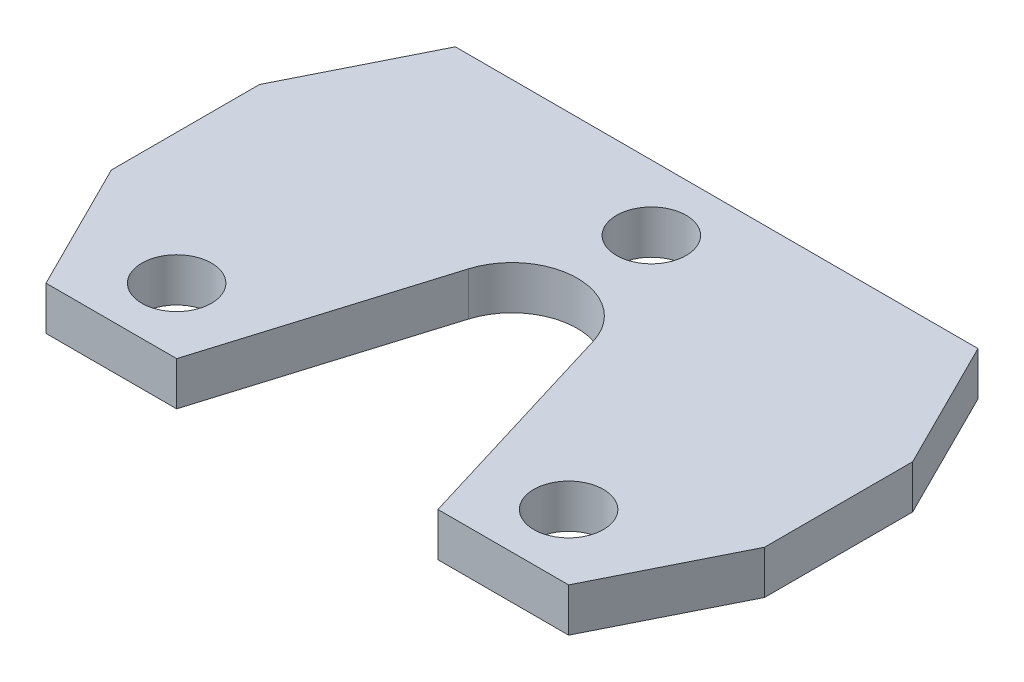
ISO-10303-21;
HEADER;
FILE_DESCRIPTION(('STEP AP214'),'2;1');
FILE_NAME('part.step','',(''),(''),'','','');
FILE_SCHEMA(('AUTOMOTIVE_DESIGN { 1 0 10303 214 1 1 1 1 }'));
ENDSEC;
DATA;
#1=APPLICATION_CONTEXT('core data for automotive mechanical design processes');
#2=APPLICATION_PROTOCOL_DEFINITION('international standard','automotive_design',2000,#1);
#3=PRODUCT_CONTEXT('',#1,'mechanical');
#4=PRODUCT('Part','Part','',(#3));
#5=PRODUCT_RELATED_PRODUCT_CATEGORY('part','',(#4));
#6=PRODUCT_DEFINITION_FORMATION('','',#4);
#7=PRODUCT_DEFINITION_CONTEXT('part definition',#1,'design');
#8=PRODUCT_DEFINITION('design','',#6,#7);
#9=PRODUCT_DEFINITION_SHAPE('','',#8);
#10=(LENGTH_UNIT() NAMED_UNIT(*) SI_UNIT(.MILLI.,.METRE.));
#11=(NAMED_UNIT(*) PLANE_ANGLE_UNIT() SI_UNIT($,.RADIAN.));
#12=(NAMED_UNIT(*) SI_UNIT($,.STERADIAN.) SOLID_ANGLE_UNIT());
#13=UNCERTAINTY_MEASURE_WITH_UNIT(LENGTH_MEASURE(1.E-05),#10,'distance_accuracy_value','');
#14=(GEOMETRIC_REPRESENTATION_CONTEXT(3) GLOBAL_UNCERTAINTY_ASSIGNED_CONTEXT((#13)) GLOBAL_UNIT_ASSIGNED_CONTEXT((#10,
#11,#12)) REPRESENTATION_CONTEXT('',''));
#15=CARTESIAN_POINT('',(0.,0.,0.));
#16=DIRECTION('',(0.,0.,1.));
#17=DIRECTION('',(1.,0.,0.));
#18=AXIS2_PLACEMENT_3D('',#15,#16,#17);
#19=CARTESIAN_POINT('',(-0.000168311706078194,10.,19.6990291262136));
#20=DIRECTION('',(0.,1.,0.));
#21=DIRECTION('',(0.,0.,1.));
#22=AXIS2_PLACEMENT_3D('',#19,#20,#21);
#23=PLANE('',#22);
#24=CARTESIAN_POINT('',(0.,10.,-12.3009708737864));
#25=DIRECTION('',(0.,1.,0.));
#26=DIRECTION('',(0.,0.,1.));
#27=AXIS2_PLACEMENT_3D('',#24,#25,#26);
#28=CIRCLE('',#27,8.);
#29=CARTESIAN_POINT('',(0.,10.,-4.30097087378638));
#30=VERTEX_POINT('',#29);
#31=EDGE_CURVE('E285',#30,#30,#28,.T.);
#32=ORIENTED_EDGE('',*,*,#31,.F.);
#33=EDGE_LOOP('',(#32));
#34=FACE_BOUND('',#33,.T.);
#35=DIRECTION('',(-0.447213595499958,0.,0.894427190999916));
#36=VECTOR('',#35,1.);
#37=CARTESIAN_POINT('',(-60.,10.,-27.3009708737864));
#38=LINE('',#37,#36);
#39=CARTESIAN_POINT('',(-60.,10.,-27.3009708737864));
#40=VERTEX_POINT('',#39);
#41=CARTESIAN_POINT('',(-75.,10.,2.69902912621361));
#42=VERTEX_POINT('',#41);
#43=EDGE_CURVE('E176',#40,#42,#38,.T.);
#44=ORIENTED_EDGE('',*,*,#43,.T.);
#45=DIRECTION('',(0.,0.,1.));
#46=VECTOR('',#45,1.);
#47=CARTESIAN_POINT('',(-75.,10.,2.69902912621361));
#48=LINE('',#47,#46);
#49=CARTESIAN_POINT('',(-75.,10.,36.6990291262136));
#50=VERTEX_POINT('',#49);
#51=EDGE_CURVE('E104',#42,#50,#48,.T.);
#52=ORIENTED_EDGE('',*,*,#51,.T.);
#53=DIRECTION('',(0.447213595499958,0.,0.894427190999916));
#54=VECTOR('',#53,1.);
#55=CARTESIAN_POINT('',(-75.,10.,36.6990291262136));
#56=LINE('',#55,#54);
#57=CARTESIAN_POINT('',(-60.,10.,66.6990291262136));
#58=VERTEX_POINT('',#57);
#59=EDGE_CURVE('E203',#50,#58,#56,.T.);
#60=ORIENTED_EDGE('',*,*,#59,.T.);
#61=DIRECTION('',(1.,0.,0.));
#62=VECTOR('',#61,1.);
#63=CARTESIAN_POINT('',(-60.,10.,66.6990291262136));
#64=LINE('',#63,#62);
#65=CARTESIAN_POINT('',(-30.,10.,66.6990291262136));
#66=VERTEX_POINT('',#65);
#67=EDGE_CURVE('E222',#58,#66,#64,.T.);
#68=ORIENTED_EDGE('',*,*,#67,.T.);
#69=DIRECTION('',(0.291437408209057,0.,-0.956589900164322));
#70=VECTOR('',#69,1.);
#71=CARTESIAN_POINT('',(-30.,10.,66.6990291262136));
#72=LINE('',#71,#70);
#73=CARTESIAN_POINT('',(-14.3489955911008,10.,15.3274744689588));
#74=VERTEX_POINT('',#73);
#75=EDGE_CURVE('E219',#66,#74,#72,.T.);
#76=ORIENTED_EDGE('',*,*,#75,.T.);
#77=CARTESIAN_POINT('',(-0.000168311706078194,10.,19.6990291262136));
#78=DIRECTION('',(0.,-1.,0.));
#79=DIRECTION('',(0.,0.,1.));
#80=AXIS2_PLACEMENT_3D('',#77,#78,#79);
#81=CIRCLE('',#80,14.9999778138258);
#82=CARTESIAN_POINT('',(14.3486327549606,10.,15.3273884314068));
#83=VERTEX_POINT('',#82);
#84=EDGE_CURVE('E221',#74,#83,#81,.T.);
#85=ORIENTED_EDGE('',*,*,#84,.T.);
#86=DIRECTION('',(0.291443144054347,0.,0.956588152646539));
#87=VECTOR('',#86,1.);
#88=CARTESIAN_POINT('',(30.,10.,66.6990291262136));
#89=LINE('',#88,#87);
#90=CARTESIAN_POINT('',(30.,10.,66.6990291262136));
#91=VERTEX_POINT('',#90);
#92=EDGE_CURVE('E224',#83,#91,#89,.T.);
#93=ORIENTED_EDGE('',*,*,#92,.T.);
#94=DIRECTION('',(1.,0.,0.));
#95=VECTOR('',#94,1.);
#96=CARTESIAN_POINT('',(60.,10.,66.6990291262136));
#97=LINE('',#96,#95);
#98=CARTESIAN_POINT('',(60.,10.,66.6990291262136));
#99=VERTEX_POINT('',#98);
#100=EDGE_CURVE('E230',#91,#99,#97,.T.);
#101=ORIENTED_EDGE('',*,*,#100,.T.);
#102=DIRECTION('',(0.447213595499958,0.,-0.894427190999916));
#103=VECTOR('',#102,1.);
#104=CARTESIAN_POINT('',(75.,10.,36.6990291262136));
#105=LINE('',#104,#103);
#106=CARTESIAN_POINT('',(75.,10.,36.6990291262136));
#107=VERTEX_POINT('',#106);
#108=EDGE_CURVE('E135',#99,#107,#105,.T.);
#109=ORIENTED_EDGE('',*,*,#108,.T.);
#110=DIRECTION('',(0.,0.,-1.));
#111=VECTOR('',#110,1.);
#112=CARTESIAN_POINT('',(75.,10.,2.69902912621361));
#113=LINE('',#112,#111);
#114=CARTESIAN_POINT('',(75.,10.,2.69902912621361));
#115=VERTEX_POINT('',#114);
#116=EDGE_CURVE('E129',#107,#115,#113,.T.);
#117=ORIENTED_EDGE('',*,*,#116,.T.);
#118=DIRECTION('',(-0.447213595499958,0.,-0.894427190999916));
#119=VECTOR('',#118,1.);
#120=CARTESIAN_POINT('',(60.,10.,-27.3009708737864));
#121=LINE('',#120,#119);
#122=CARTESIAN_POINT('',(60.,10.,-27.3009708737864));
#123=VERTEX_POINT('',#122);
#124=EDGE_CURVE('E133',#115,#123,#121,.T.);
#125=ORIENTED_EDGE('',*,*,#124,.T.);
#126=DIRECTION('',(-1.,0.,0.));
#127=VECTOR('',#126,1.);
#128=CARTESIAN_POINT('',(-60.,10.,-27.3009708737864));
#129=LINE('',#128,#127);
#130=EDGE_CURVE('E49',#123,#40,#129,.T.);
#131=ORIENTED_EDGE('',*,*,#130,.T.);
#132=EDGE_LOOP('',(#44,#52,#60,#68,#76,#85,#93,#101,#109,#117,#125,#131));
#133=FACE_BOUND('',#132,.T.);
#134=CARTESIAN_POINT('',(-45.,10.,51.6990291262136));
#135=DIRECTION('',(0.,1.,0.));
#136=DIRECTION('',(0.,0.,1.));
#137=AXIS2_PLACEMENT_3D('',#134,#135,#136);
#138=CIRCLE('',#137,8.);
#139=CARTESIAN_POINT('',(-45.,10.,59.6990291262136));
#140=VERTEX_POINT('',#139);
#141=EDGE_CURVE('E157',#140,#140,#138,.T.);
#142=ORIENTED_EDGE('',*,*,#141,.F.);
#143=EDGE_LOOP('',(#142));
#144=FACE_BOUND('',#143,.T.);
#145=CARTESIAN_POINT('',(45.,10.,51.6990291262136));
#146=DIRECTION('',(0.,1.,0.));
#147=DIRECTION('',(0.,0.,1.));
#148=AXIS2_PLACEMENT_3D('',#145,#146,#147);
#149=CIRCLE('',#148,8.);
#150=CARTESIAN_POINT('',(45.,10.,59.6990291262136));
#151=VERTEX_POINT('',#150);
#152=EDGE_CURVE('E276',#151,#151,#149,.T.);
#153=ORIENTED_EDGE('',*,*,#152,.F.);
#154=EDGE_LOOP('',(#153));
#155=FACE_BOUND('',#154,.T.);
#156=ADVANCED_FACE('F32',(#34,#133,#144,#155),#23,.T.);
#157=CARTESIAN_POINT('',(-0.000168311706078194,0.,19.6990291262136));
#158=DIRECTION('',(0.,1.,0.));
#159=DIRECTION('',(0.,0.,1.));
#160=AXIS2_PLACEMENT_3D('',#157,#158,#159);
#161=PLANE('',#160);
#162=DIRECTION('',(-0.447213595499958,0.,0.894427190999916));
#163=VECTOR('',#162,1.);
#164=CARTESIAN_POINT('',(-60.,0.,-27.3009708737864));
#165=LINE('',#164,#163);
#166=CARTESIAN_POINT('',(-60.,0.,-27.3009708737864));
#167=VERTEX_POINT('',#166);
#168=CARTESIAN_POINT('',(-75.,0.,2.69902912621361));
#169=VERTEX_POINT('',#168);
#170=EDGE_CURVE('E153',#167,#169,#165,.T.);
#171=ORIENTED_EDGE('',*,*,#170,.F.);
#172=DIRECTION('',(-1.,0.,0.));
#173=VECTOR('',#172,1.);
#174=CARTESIAN_POINT('',(-60.,0.,-27.3009708737864));
#175=LINE('',#174,#173);
#176=CARTESIAN_POINT('',(60.,0.,-27.3009708737864));
#177=VERTEX_POINT('',#176);
#178=EDGE_CURVE('E96',#177,#167,#175,.T.);
#179=ORIENTED_EDGE('',*,*,#178,.F.);
#180=DIRECTION('',(-0.447213595499958,0.,-0.894427190999916));
#181=VECTOR('',#180,1.);
#182=CARTESIAN_POINT('',(60.,0.,-27.3009708737864));
#183=LINE('',#182,#181);
#184=CARTESIAN_POINT('',(75.,0.,2.69902912621361));
#185=VERTEX_POINT('',#184);
#186=EDGE_CURVE('E90',#185,#177,#183,.T.);
#187=ORIENTED_EDGE('',*,*,#186,.F.);
#188=DIRECTION('',(0.,0.,-1.));
#189=VECTOR('',#188,1.);
#190=CARTESIAN_POINT('',(75.,0.,2.69902912621361));
#191=LINE('',#190,#189);
#192=CARTESIAN_POINT('',(75.,0.,36.6990291262136));
#193=VERTEX_POINT('',#192);
#194=EDGE_CURVE('E143',#193,#185,#191,.T.);
#195=ORIENTED_EDGE('',*,*,#194,.F.);
#196=DIRECTION('',(0.447213595499958,0.,-0.894427190999916));
#197=VECTOR('',#196,1.);
#198=CARTESIAN_POINT('',(75.,0.,36.6990291262136));
#199=LINE('',#198,#197);
#200=CARTESIAN_POINT('',(60.,0.,66.6990291262136));
#201=VERTEX_POINT('',#200);
#202=EDGE_CURVE('E171',#201,#193,#199,.T.);
#203=ORIENTED_EDGE('',*,*,#202,.F.);
#204=DIRECTION('',(1.,0.,0.));
#205=VECTOR('',#204,1.);
#206=CARTESIAN_POINT('',(60.,0.,66.6990291262136));
#207=LINE('',#206,#205);
#208=CARTESIAN_POINT('',(30.,0.,66.6990291262136));
#209=VERTEX_POINT('',#208);
#210=EDGE_CURVE('E169',#209,#201,#207,.T.);
#211=ORIENTED_EDGE('',*,*,#210,.F.);
#212=DIRECTION('',(0.291443144054347,0.,0.956588152646539));
#213=VECTOR('',#212,1.);
#214=CARTESIAN_POINT('',(30.,0.,66.6990291262136));
#215=LINE('',#214,#213);
#216=CARTESIAN_POINT('',(14.3486327549606,0.,15.3273884314068));
#217=VERTEX_POINT('',#216);
#218=EDGE_CURVE('E167',#217,#209,#215,.T.);
#219=ORIENTED_EDGE('',*,*,#218,.F.);
#220=CARTESIAN_POINT('',(-0.000168311706078194,0.,19.6990291262136));
#221=DIRECTION('',(0.,-1.,0.));
#222=DIRECTION('',(0.,0.,1.));
#223=AXIS2_PLACEMENT_3D('',#220,#221,#222);
#224=CIRCLE('',#223,14.9999778138258);
#225=CARTESIAN_POINT('',(-14.3489955911008,0.,15.3274744689588));
#226=VERTEX_POINT('',#225);
#227=EDGE_CURVE('E165',#226,#217,#224,.T.);
#228=ORIENTED_EDGE('',*,*,#227,.F.);
#229=DIRECTION('',(0.291437408209057,0.,-0.956589900164322));
#230=VECTOR('',#229,1.);
#231=CARTESIAN_POINT('',(-30.,0.,66.6990291262136));
#232=LINE('',#231,#230);
#233=CARTESIAN_POINT('',(-30.,0.,66.6990291262136));
#234=VERTEX_POINT('',#233);
#235=EDGE_CURVE('E163',#234,#226,#232,.T.);
#236=ORIENTED_EDGE('',*,*,#235,.F.);
#237=DIRECTION('',(1.,0.,0.));
#238=VECTOR('',#237,1.);
#239=CARTESIAN_POINT('',(-60.,0.,66.6990291262136));
#240=LINE('',#239,#238);
#241=CARTESIAN_POINT('',(-60.,0.,66.6990291262136));
#242=VERTEX_POINT('',#241);
#243=EDGE_CURVE('E161',#242,#234,#240,.T.);
#244=ORIENTED_EDGE('',*,*,#243,.F.);
#245=DIRECTION('',(0.447213595499958,0.,0.894427190999916));
#246=VECTOR('',#245,1.);
#247=CARTESIAN_POINT('',(-75.,0.,36.6990291262136));
#248=LINE('',#247,#246);
#249=CARTESIAN_POINT('',(-75.,0.,36.6990291262136));
#250=VERTEX_POINT('',#249);
#251=EDGE_CURVE('E159',#250,#242,#248,.T.);
#252=ORIENTED_EDGE('',*,*,#251,.F.);
#253=DIRECTION('',(0.,0.,1.));
#254=VECTOR('',#253,1.);
#255=CARTESIAN_POINT('',(-75.,0.,2.69902912621361));
#256=LINE('',#255,#254);
#257=EDGE_CURVE('E156',#169,#250,#256,.T.);
#258=ORIENTED_EDGE('',*,*,#257,.F.);
#259=EDGE_LOOP('',(#171,#179,#187,#195,#203,#211,#219,#228,#236,#244,#252,#258));
#260=FACE_BOUND('',#259,.T.);
#261=CARTESIAN_POINT('',(-45.,0.,51.6990291262136));
#262=DIRECTION('',(0.,1.,0.));
#263=DIRECTION('',(0.,0.,1.));
#264=AXIS2_PLACEMENT_3D('',#261,#262,#263);
#265=CIRCLE('',#264,8.);
#266=CARTESIAN_POINT('',(-45.,0.,59.6990291262136));
#267=VERTEX_POINT('',#266);
#268=EDGE_CURVE('E288',#267,#267,#265,.T.);
#269=ORIENTED_EDGE('',*,*,#268,.T.);
#270=EDGE_LOOP('',(#269));
#271=FACE_BOUND('',#270,.T.);
#272=CARTESIAN_POINT('',(0.,0.,-12.3009708737864));
#273=DIRECTION('',(0.,1.,0.));
#274=DIRECTION('',(0.,0.,1.));
#275=AXIS2_PLACEMENT_3D('',#272,#273,#274);
#276=CIRCLE('',#275,8.);
#277=CARTESIAN_POINT('',(0.,0.,-4.30097087378638));
#278=VERTEX_POINT('',#277);
#279=EDGE_CURVE('E282',#278,#278,#276,.T.);
#280=ORIENTED_EDGE('',*,*,#279,.T.);
#281=EDGE_LOOP('',(#280));
#282=FACE_BOUND('',#281,.T.);
#283=CARTESIAN_POINT('',(45.,0.,51.6990291262136));
#284=DIRECTION('',(0.,1.,0.));
#285=DIRECTION('',(0.,0.,1.));
#286=AXIS2_PLACEMENT_3D('',#283,#284,#285);
#287=CIRCLE('',#286,8.);
#288=CARTESIAN_POINT('',(45.,0.,59.6990291262136));
#289=VERTEX_POINT('',#288);
#290=EDGE_CURVE('E279',#289,#289,#287,.T.);
#291=ORIENTED_EDGE('',*,*,#290,.T.);
#292=EDGE_LOOP('',(#291));
#293=FACE_BOUND('',#292,.T.);
#294=ADVANCED_FACE('F207',(#260,#271,#282,#293),#161,.F.);
#295=CARTESIAN_POINT('',(-60.,10.,-27.3009708737864));
#296=DIRECTION('',(0.894427190999916,0.,0.447213595499958));
#297=DIRECTION('',(0.447213595499958,0.,-0.894427190999916));
#298=AXIS2_PLACEMENT_3D('',#295,#296,#297);
#299=PLANE('',#298);
#300=ORIENTED_EDGE('',*,*,#170,.T.);
#301=DIRECTION('',(0.,-1.,0.));
#302=VECTOR('',#301,1.);
#303=CARTESIAN_POINT('',(-75.,10.,2.69902912621361));
#304=LINE('',#303,#302);
#305=EDGE_CURVE('E11',#42,#169,#304,.T.);
#306=ORIENTED_EDGE('',*,*,#305,.F.);
#307=ORIENTED_EDGE('',*,*,#43,.F.);
#308=DIRECTION('',(0.,-1.,0.));
#309=VECTOR('',#308,1.);
#310=CARTESIAN_POINT('',(-60.,10.,-27.3009708737864));
#311=LINE('',#310,#309);
#312=EDGE_CURVE('E149',#40,#167,#311,.T.);
#313=ORIENTED_EDGE('',*,*,#312,.T.);
#314=EDGE_LOOP('',(#300,#306,#307,#313));
#315=FACE_BOUND('',#314,.T.);
#316=ADVANCED_FACE('F34',(#315),#299,.F.);
#317=CARTESIAN_POINT('',(-75.,10.,2.69902912621361));
#318=DIRECTION('',(1.,0.,0.));
#319=DIRECTION('',(0.,0.,-1.));
#320=AXIS2_PLACEMENT_3D('',#317,#318,#319);
#321=PLANE('',#320);
#322=ORIENTED_EDGE('',*,*,#257,.T.);
#323=DIRECTION('',(0.,-1.,0.));
#324=VECTOR('',#323,1.);
#325=CARTESIAN_POINT('',(-75.,10.,36.6990291262136));
#326=LINE('',#325,#324);
#327=EDGE_CURVE('E41',#50,#250,#326,.T.);
#328=ORIENTED_EDGE('',*,*,#327,.F.);
#329=ORIENTED_EDGE('',*,*,#51,.F.);
#330=ORIENTED_EDGE('',*,*,#305,.T.);
#331=EDGE_LOOP('',(#322,#328,#329,#330));
#332=FACE_BOUND('',#331,.T.);
#333=ADVANCED_FACE('F390',(#332),#321,.F.);
#334=CARTESIAN_POINT('',(-75.,10.,36.6990291262136));
#335=DIRECTION('',(0.894427190999916,0.,-0.447213595499958));
#336=DIRECTION('',(-0.447213595499958,0.,-0.894427190999916));
#337=AXIS2_PLACEMENT_3D('',#334,#335,#336);
#338=PLANE('',#337);
#339=ORIENTED_EDGE('',*,*,#251,.T.);
#340=DIRECTION('',(0.,-1.,0.));
#341=VECTOR('',#340,1.);
#342=CARTESIAN_POINT('',(-60.,10.,66.6990291262136));
#343=LINE('',#342,#341);
#344=EDGE_CURVE('E195',#58,#242,#343,.T.);
#345=ORIENTED_EDGE('',*,*,#344,.F.);
#346=ORIENTED_EDGE('',*,*,#59,.F.);
#347=ORIENTED_EDGE('',*,*,#327,.T.);
#348=EDGE_LOOP('',(#339,#345,#346,#347));
#349=FACE_BOUND('',#348,.T.);
#350=ADVANCED_FACE('F201',(#349),#338,.F.);
#351=CARTESIAN_POINT('',(-60.,10.,66.6990291262136));
#352=DIRECTION('',(0.,0.,-1.));
#353=DIRECTION('',(-1.,0.,0.));
#354=AXIS2_PLACEMENT_3D('',#351,#352,#353);
#355=PLANE('',#354);
#356=ORIENTED_EDGE('',*,*,#243,.T.);
#357=DIRECTION('',(0.,-1.,0.));
#358=VECTOR('',#357,1.);
#359=CARTESIAN_POINT('',(-30.,10.,66.6990291262136));
#360=LINE('',#359,#358);
#361=EDGE_CURVE('E192',#66,#234,#360,.T.);
#362=ORIENTED_EDGE('',*,*,#361,.F.);
#363=ORIENTED_EDGE('',*,*,#67,.F.);
#364=ORIENTED_EDGE('',*,*,#344,.T.);
#365=EDGE_LOOP('',(#356,#362,#363,#364));
#366=FACE_BOUND('',#365,.T.);
#367=ADVANCED_FACE('F213',(#366),#355,.F.);
#368=CARTESIAN_POINT('',(-30.,10.,66.6990291262136));
#369=DIRECTION('',(-0.956589900164322,0.,-0.291437408209057));
#370=DIRECTION('',(-0.291437408209057,0.,0.956589900164322));
#371=AXIS2_PLACEMENT_3D('',#368,#369,#370);
#372=PLANE('',#371);
#373=ORIENTED_EDGE('',*,*,#235,.T.);
#374=DIRECTION('',(0.,-1.,0.));
#375=VECTOR('',#374,1.);
#376=CARTESIAN_POINT('',(-14.3489955911008,10.,15.3274744689588));
#377=LINE('',#376,#375);
#378=EDGE_CURVE('E189',#74,#226,#377,.T.);
#379=ORIENTED_EDGE('',*,*,#378,.F.);
#380=ORIENTED_EDGE('',*,*,#75,.F.);
#381=ORIENTED_EDGE('',*,*,#361,.T.);
#382=EDGE_LOOP('',(#373,#379,#380,#381));
#383=FACE_BOUND('',#382,.T.);
#384=ADVANCED_FACE('F217',(#383),#372,.F.);
#385=CARTESIAN_POINT('',(-0.000168311706078194,10.,19.6990291262136));
#386=DIRECTION('',(0.,-1.,0.));
#387=DIRECTION('',(0.,0.,-1.));
#388=AXIS2_PLACEMENT_3D('',#385,#386,#387);
#389=CYLINDRICAL_SURFACE('',#388,14.9999778138258);
#390=ORIENTED_EDGE('',*,*,#227,.T.);
#391=DIRECTION('',(0.,-1.,0.));
#392=VECTOR('',#391,1.);
#393=CARTESIAN_POINT('',(14.3486327549606,10.,15.3273884314068));
#394=LINE('',#393,#392);
#395=EDGE_CURVE('E186',#83,#217,#394,.T.);
#396=ORIENTED_EDGE('',*,*,#395,.F.);
#397=ORIENTED_EDGE('',*,*,#84,.F.);
#398=ORIENTED_EDGE('',*,*,#378,.T.);
#399=EDGE_LOOP('',(#390,#396,#397,#398));
#400=FACE_BOUND('',#399,.T.);
#401=ADVANCED_FACE('F355',(#400),#389,.F.);
#402=CARTESIAN_POINT('',(30.,10.,66.6990291262136));
#403=DIRECTION('',(0.956588152646538,0.,-0.291443144054347));
#404=DIRECTION('',(-0.291443144054347,0.,-0.956588152646538));
#405=AXIS2_PLACEMENT_3D('',#402,#403,#404);
#406=PLANE('',#405);
#407=ORIENTED_EDGE('',*,*,#218,.T.);
#408=DIRECTION('',(0.,-1.,0.));
#409=VECTOR('',#408,1.);
#410=CARTESIAN_POINT('',(30.,10.,66.6990291262136));
#411=LINE('',#410,#409);
#412=EDGE_CURVE('E183',#91,#209,#411,.T.);
#413=ORIENTED_EDGE('',*,*,#412,.F.);
#414=ORIENTED_EDGE('',*,*,#92,.F.);
#415=ORIENTED_EDGE('',*,*,#395,.T.);
#416=EDGE_LOOP('',(#407,#413,#414,#415));
#417=FACE_BOUND('',#416,.T.);
#418=ADVANCED_FACE('F346',(#417),#406,.F.);
#419=CARTESIAN_POINT('',(60.,10.,66.6990291262136));
#420=DIRECTION('',(0.,0.,-1.));
#421=DIRECTION('',(-1.,0.,0.));
#422=AXIS2_PLACEMENT_3D('',#419,#420,#421);
#423=PLANE('',#422);
#424=ORIENTED_EDGE('',*,*,#210,.T.);
#425=DIRECTION('',(0.,-1.,0.));
#426=VECTOR('',#425,1.);
#427=CARTESIAN_POINT('',(60.,10.,66.6990291262136));
#428=LINE('',#427,#426);
#429=EDGE_CURVE('E180',#99,#201,#428,.T.);
#430=ORIENTED_EDGE('',*,*,#429,.F.);
#431=ORIENTED_EDGE('',*,*,#100,.F.);
#432=ORIENTED_EDGE('',*,*,#412,.T.);
#433=EDGE_LOOP('',(#424,#430,#431,#432));
#434=FACE_BOUND('',#433,.T.);
#435=ADVANCED_FACE('F236',(#434),#423,.F.);
#436=CARTESIAN_POINT('',(75.,10.,36.6990291262136));
#437=DIRECTION('',(-0.894427190999916,0.,-0.447213595499958));
#438=DIRECTION('',(-0.447213595499958,0.,0.894427190999916));
#439=AXIS2_PLACEMENT_3D('',#436,#437,#438);
#440=PLANE('',#439);
#441=ORIENTED_EDGE('',*,*,#202,.T.);
#442=DIRECTION('',(0.,-1.,0.));
#443=VECTOR('',#442,1.);
#444=CARTESIAN_POINT('',(75.,10.,36.6990291262136));
#445=LINE('',#444,#443);
#446=EDGE_CURVE('E144',#107,#193,#445,.T.);
#447=ORIENTED_EDGE('',*,*,#446,.F.);
#448=ORIENTED_EDGE('',*,*,#108,.F.);
#449=ORIENTED_EDGE('',*,*,#429,.T.);
#450=EDGE_LOOP('',(#441,#447,#448,#449));
#451=FACE_BOUND('',#450,.T.);
#452=ADVANCED_FACE('F240',(#451),#440,.F.);
#453=CARTESIAN_POINT('',(75.,10.,2.69902912621361));
#454=DIRECTION('',(-1.,0.,0.));
#455=DIRECTION('',(0.,0.,1.));
#456=AXIS2_PLACEMENT_3D('',#453,#454,#455);
#457=PLANE('',#456);
#458=ORIENTED_EDGE('',*,*,#194,.T.);
#459=DIRECTION('',(0.,-1.,0.));
#460=VECTOR('',#459,1.);
#461=CARTESIAN_POINT('',(75.,10.,2.69902912621361));
#462=LINE('',#461,#460);
#463=EDGE_CURVE('E140',#115,#185,#462,.T.);
#464=ORIENTED_EDGE('',*,*,#463,.F.);
#465=ORIENTED_EDGE('',*,*,#116,.F.);
#466=ORIENTED_EDGE('',*,*,#446,.T.);
#467=EDGE_LOOP('',(#458,#464,#465,#466));
#468=FACE_BOUND('',#467,.T.);
#469=ADVANCED_FACE('F141',(#468),#457,.F.);
#470=CARTESIAN_POINT('',(60.,10.,-27.3009708737864));
#471=DIRECTION('',(-0.894427190999916,0.,0.447213595499958));
#472=DIRECTION('',(0.447213595499958,0.,0.894427190999916));
#473=AXIS2_PLACEMENT_3D('',#470,#471,#472);
#474=PLANE('',#473);
#475=ORIENTED_EDGE('',*,*,#186,.T.);
#476=DIRECTION('',(0.,-1.,0.));
#477=VECTOR('',#476,1.);
#478=CARTESIAN_POINT('',(60.,10.,-27.3009708737864));
#479=LINE('',#478,#477);
#480=EDGE_CURVE('E145',#123,#177,#479,.T.);
#481=ORIENTED_EDGE('',*,*,#480,.F.);
#482=ORIENTED_EDGE('',*,*,#124,.F.);
#483=ORIENTED_EDGE('',*,*,#463,.T.);
#484=EDGE_LOOP('',(#475,#481,#482,#483));
#485=FACE_BOUND('',#484,.T.);
#486=ADVANCED_FACE('F147',(#485),#474,.F.);
#487=CARTESIAN_POINT('',(-60.,10.,-27.3009708737864));
#488=DIRECTION('',(0.,0.,1.));
#489=DIRECTION('',(1.,0.,0.));
#490=AXIS2_PLACEMENT_3D('',#487,#488,#489);
#491=PLANE('',#490);
#492=ORIENTED_EDGE('',*,*,#178,.T.);
#493=ORIENTED_EDGE('',*,*,#312,.F.);
#494=ORIENTED_EDGE('',*,*,#130,.F.);
#495=ORIENTED_EDGE('',*,*,#480,.T.);
#496=EDGE_LOOP('',(#492,#493,#494,#495));
#497=FACE_BOUND('',#496,.T.);
#498=ADVANCED_FACE('F244',(#497),#491,.F.);
#499=CARTESIAN_POINT('',(-45.,10.,51.6990291262136));
#500=DIRECTION('',(0.,-1.,0.));
#501=DIRECTION('',(0.,0.,-1.));
#502=AXIS2_PLACEMENT_3D('',#499,#500,#501);
#503=CYLINDRICAL_SURFACE('',#502,8.);
#504=ORIENTED_EDGE('',*,*,#141,.T.);
#505=EDGE_LOOP('',(#504));
#506=FACE_BOUND('',#505,.T.);
#507=ORIENTED_EDGE('',*,*,#268,.F.);
#508=EDGE_LOOP('',(#507));
#509=FACE_BOUND('',#508,.T.);
#510=ADVANCED_FACE('F246',(#506,#509),#503,.F.);
#511=CARTESIAN_POINT('',(0.,10.,-12.3009708737864));
#512=DIRECTION('',(0.,-1.,0.));
#513=DIRECTION('',(0.,0.,-1.));
#514=AXIS2_PLACEMENT_3D('',#511,#512,#513);
#515=CYLINDRICAL_SURFACE('',#514,8.);
#516=ORIENTED_EDGE('',*,*,#31,.T.);
#517=EDGE_LOOP('',(#516));
#518=FACE_BOUND('',#517,.T.);
#519=ORIENTED_EDGE('',*,*,#279,.F.);
#520=EDGE_LOOP('',(#519));
#521=FACE_BOUND('',#520,.T.);
#522=ADVANCED_FACE('F252',(#518,#521),#515,.F.);
#523=CARTESIAN_POINT('',(45.,10.,51.6990291262136));
#524=DIRECTION('',(0.,-1.,0.));
#525=DIRECTION('',(0.,0.,-1.));
#526=AXIS2_PLACEMENT_3D('',#523,#524,#525);
#527=CYLINDRICAL_SURFACE('',#526,8.);
#528=ORIENTED_EDGE('',*,*,#152,.T.);
#529=EDGE_LOOP('',(#528));
#530=FACE_BOUND('',#529,.T.);
#531=ORIENTED_EDGE('',*,*,#290,.F.);
#532=EDGE_LOOP('',(#531));
#533=FACE_BOUND('',#532,.T.);
#534=ADVANCED_FACE('F267',(#530,#533),#527,.F.);
#535=CLOSED_SHELL('',(#156,#294,#316,#333,#350,#367,#384,#401,#418,#435,#452,#469,#486,#498,
#510,#522,#534));
#536=MANIFOLD_SOLID_BREP('B2',#535);
#537=ADVANCED_BREP_SHAPE_REPRESENTATION('',(#18,#536),#14);
#538=SHAPE_DEFINITION_REPRESENTATION(#9,#537);
ENDSEC;
END-ISO-10303-21;
